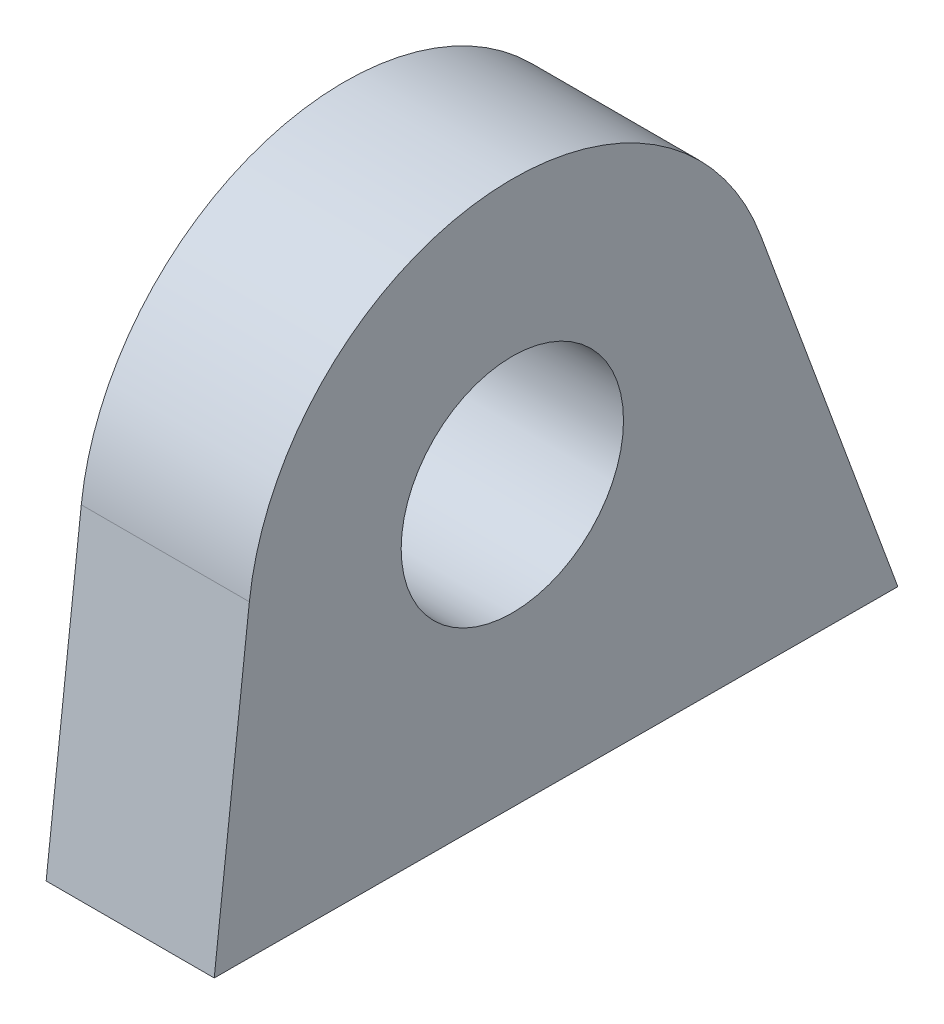
ISO-10303-21;
HEADER;
FILE_DESCRIPTION(('STEP AP214'),'2;1');
FILE_NAME('part.step','',(''),(''),'','','');
FILE_SCHEMA(('AUTOMOTIVE_DESIGN { 1 0 10303 214 1 1 1 1 }'));
ENDSEC;
DATA;
#1=APPLICATION_CONTEXT('core data for automotive mechanical design processes');
#2=APPLICATION_PROTOCOL_DEFINITION('international standard','automotive_design',2000,#1);
#3=PRODUCT_CONTEXT('',#1,'mechanical');
#4=PRODUCT('Part','Part','',(#3));
#5=PRODUCT_RELATED_PRODUCT_CATEGORY('part','',(#4));
#6=PRODUCT_DEFINITION_FORMATION('','',#4);
#7=PRODUCT_DEFINITION_CONTEXT('part definition',#1,'design');
#8=PRODUCT_DEFINITION('design','',#6,#7);
#9=PRODUCT_DEFINITION_SHAPE('','',#8);
#10=(LENGTH_UNIT() NAMED_UNIT(*) SI_UNIT(.MILLI.,.METRE.));
#11=(NAMED_UNIT(*) PLANE_ANGLE_UNIT() SI_UNIT($,.RADIAN.));
#12=(NAMED_UNIT(*) SI_UNIT($,.STERADIAN.) SOLID_ANGLE_UNIT());
#13=UNCERTAINTY_MEASURE_WITH_UNIT(LENGTH_MEASURE(1.E-05),#10,'distance_accuracy_value','');
#14=(GEOMETRIC_REPRESENTATION_CONTEXT(3) GLOBAL_UNCERTAINTY_ASSIGNED_CONTEXT((#13)) GLOBAL_UNIT_ASSIGNED_CONTEXT((#10,
#11,#12)) REPRESENTATION_CONTEXT('',''));
#15=CARTESIAN_POINT('',(0.,0.,0.));
#16=DIRECTION('',(0.,0.,1.));
#17=DIRECTION('',(1.,0.,0.));
#18=AXIS2_PLACEMENT_3D('',#15,#16,#17);
#19=CARTESIAN_POINT('',(77.6424000700383,357.223601629017,-762.3289681282));
#20=DIRECTION('',(1.,0.,0.));
#21=DIRECTION('',(0.,0.,-1.));
#22=AXIS2_PLACEMENT_3D('',#19,#20,#21);
#23=PLANE('',#22);
#24=DIRECTION('',(0.,-0.00427691607470319,-0.99999085395262));
#25=VECTOR('',#24,1.);
#26=CARTESIAN_POINT('',(77.6424000700383,346.710990224422,-751.065744258363));
#27=LINE('',#26,#25);
#28=CARTESIAN_POINT('',(77.6424000700383,346.710990224422,-751.065744258363));
#29=VERTEX_POINT('',#28);
#30=CARTESIAN_POINT('',(77.6424000700383,346.600522458506,-776.894344502893));
#31=VERTEX_POINT('',#30);
#32=EDGE_CURVE('E96',#29,#31,#27,.T.);
#33=ORIENTED_EDGE('',*,*,#32,.T.);
#34=DIRECTION('',(0.,0.938461388630572,0.345384165892964));
#35=VECTOR('',#34,1.);
#36=CARTESIAN_POINT('',(77.6424000700383,346.600522458506,-776.894344502893));
#37=LINE('',#36,#35);
#38=CARTESIAN_POINT('',(77.6424000700383,360.677443287947,-771.713582014506));
#39=VERTEX_POINT('',#38);
#40=EDGE_CURVE('E91',#31,#39,#37,.T.);
#41=ORIENTED_EDGE('',*,*,#40,.T.);
#42=CARTESIAN_POINT('',(77.6424000700383,357.223601629017,-762.3289681282));
#43=DIRECTION('',(1.,0.,0.));
#44=DIRECTION('',(0.,0.,-1.));
#45=AXIS2_PLACEMENT_3D('',#42,#43,#44);
#46=CIRCLE('',#45,10.);
#47=CARTESIAN_POINT('',(77.6424000700383,358.35627875494,-752.393323079769));
#48=VERTEX_POINT('',#47);
#49=EDGE_CURVE('E94',#39,#48,#46,.T.);
#50=ORIENTED_EDGE('',*,*,#49,.T.);
#51=DIRECTION('',(0.,-0.993564504843091,0.113267712592353));
#52=VECTOR('',#51,1.);
#53=CARTESIAN_POINT('',(77.6424000700383,358.35627875494,-752.393323079769));
#54=LINE('',#53,#52);
#55=EDGE_CURVE('E61',#48,#29,#54,.T.);
#56=ORIENTED_EDGE('',*,*,#55,.T.);
#57=EDGE_LOOP('',(#33,#41,#50,#56));
#58=FACE_BOUND('',#57,.T.);
#59=CARTESIAN_POINT('',(77.6424000700383,357.223601629017,-762.3289681282));
#60=DIRECTION('',(1.,0.,0.));
#61=DIRECTION('',(0.,0.,-1.));
#62=AXIS2_PLACEMENT_3D('',#59,#60,#61);
#63=CIRCLE('',#62,4.19999999999998);
#64=CARTESIAN_POINT('',(77.6424000700383,357.223601629017,-766.5289681282));
#65=VERTEX_POINT('',#64);
#66=EDGE_CURVE('E116',#65,#65,#63,.T.);
#67=ORIENTED_EDGE('',*,*,#66,.F.);
#68=EDGE_LOOP('',(#67));
#69=FACE_BOUND('',#68,.T.);
#70=ADVANCED_FACE('F43',(#58,#69),#23,.T.);
#71=CARTESIAN_POINT('',(71.2924000700384,357.223601629017,-762.3289681282));
#72=DIRECTION('',(1.,0.,0.));
#73=DIRECTION('',(0.,0.,-1.));
#74=AXIS2_PLACEMENT_3D('',#71,#72,#73);
#75=PLANE('',#74);
#76=DIRECTION('',(0.,-0.00427691607470319,-0.99999085395262));
#77=VECTOR('',#76,1.);
#78=CARTESIAN_POINT('',(71.2924000700384,346.710990224422,-751.065744258363));
#79=LINE('',#78,#77);
#80=CARTESIAN_POINT('',(71.2924000700384,346.710990224422,-751.065744258363));
#81=VERTEX_POINT('',#80);
#82=CARTESIAN_POINT('',(71.2924000700384,346.600522458506,-776.894344502893));
#83=VERTEX_POINT('',#82);
#84=EDGE_CURVE('E112',#81,#83,#79,.T.);
#85=ORIENTED_EDGE('',*,*,#84,.F.);
#86=DIRECTION('',(0.,-0.993564504843091,0.113267712592353));
#87=VECTOR('',#86,1.);
#88=CARTESIAN_POINT('',(71.2924000700384,358.35627875494,-752.393323079769));
#89=LINE('',#88,#87);
#90=CARTESIAN_POINT('',(71.2924000700384,358.35627875494,-752.393323079769));
#91=VERTEX_POINT('',#90);
#92=EDGE_CURVE('E84',#91,#81,#89,.T.);
#93=ORIENTED_EDGE('',*,*,#92,.F.);
#94=CARTESIAN_POINT('',(71.2924000700384,357.223601629017,-762.3289681282));
#95=DIRECTION('',(1.,0.,0.));
#96=DIRECTION('',(0.,0.,-1.));
#97=AXIS2_PLACEMENT_3D('',#94,#95,#96);
#98=CIRCLE('',#97,10.);
#99=CARTESIAN_POINT('',(71.2924000700384,360.677443287947,-771.713582014506));
#100=VERTEX_POINT('',#99);
#101=EDGE_CURVE('E78',#100,#91,#98,.T.);
#102=ORIENTED_EDGE('',*,*,#101,.F.);
#103=DIRECTION('',(0.,0.938461388630572,0.345384165892964));
#104=VECTOR('',#103,1.);
#105=CARTESIAN_POINT('',(71.2924000700384,346.600522458506,-776.894344502893));
#106=LINE('',#105,#104);
#107=EDGE_CURVE('E101',#83,#100,#106,.T.);
#108=ORIENTED_EDGE('',*,*,#107,.F.);
#109=EDGE_LOOP('',(#85,#93,#102,#108));
#110=FACE_BOUND('',#109,.T.);
#111=CARTESIAN_POINT('',(71.2924000700384,357.223601629017,-762.3289681282));
#112=DIRECTION('',(1.,0.,0.));
#113=DIRECTION('',(0.,0.,-1.));
#114=AXIS2_PLACEMENT_3D('',#111,#112,#113);
#115=CIRCLE('',#114,4.19999999999998);
#116=CARTESIAN_POINT('',(71.2924000700384,357.223601629017,-766.5289681282));
#117=VERTEX_POINT('',#116);
#118=EDGE_CURVE('E134',#117,#117,#115,.T.);
#119=ORIENTED_EDGE('',*,*,#118,.T.);
#120=EDGE_LOOP('',(#119));
#121=FACE_BOUND('',#120,.T.);
#122=ADVANCED_FACE('F129',(#110,#121),#75,.F.);
#123=CARTESIAN_POINT('',(77.6424000700383,346.710990224422,-751.065744258363));
#124=DIRECTION('',(0.,0.99999085395262,-0.00427691607470319));
#125=DIRECTION('',(0.,0.00427691607470319,0.99999085395262));
#126=AXIS2_PLACEMENT_3D('',#123,#124,#125);
#127=PLANE('',#126);
#128=ORIENTED_EDGE('',*,*,#84,.T.);
#129=DIRECTION('',(-1.,0.,0.));
#130=VECTOR('',#129,1.);
#131=CARTESIAN_POINT('',(77.6424000700383,346.600522458506,-776.894344502893));
#132=LINE('',#131,#130);
#133=EDGE_CURVE('E11',#31,#83,#132,.T.);
#134=ORIENTED_EDGE('',*,*,#133,.F.);
#135=ORIENTED_EDGE('',*,*,#32,.F.);
#136=DIRECTION('',(-1.,0.,0.));
#137=VECTOR('',#136,1.);
#138=CARTESIAN_POINT('',(77.6424000700383,346.710990224422,-751.065744258363));
#139=LINE('',#138,#137);
#140=EDGE_CURVE('E108',#29,#81,#139,.T.);
#141=ORIENTED_EDGE('',*,*,#140,.T.);
#142=EDGE_LOOP('',(#128,#134,#135,#141));
#143=FACE_BOUND('',#142,.T.);
#144=ADVANCED_FACE('F45',(#143),#127,.F.);
#145=CARTESIAN_POINT('',(77.6424000700383,346.600522458506,-776.894344502893));
#146=DIRECTION('',(0.,-0.345384165892964,0.938461388630572));
#147=DIRECTION('',(0.,-0.938461388630572,-0.345384165892964));
#148=AXIS2_PLACEMENT_3D('',#145,#146,#147);
#149=PLANE('',#148);
#150=ORIENTED_EDGE('',*,*,#107,.T.);
#151=DIRECTION('',(-1.,0.,0.));
#152=VECTOR('',#151,1.);
#153=CARTESIAN_POINT('',(77.6424000700383,360.677443287947,-771.713582014506));
#154=LINE('',#153,#152);
#155=EDGE_CURVE('E53',#39,#100,#154,.T.);
#156=ORIENTED_EDGE('',*,*,#155,.F.);
#157=ORIENTED_EDGE('',*,*,#40,.F.);
#158=ORIENTED_EDGE('',*,*,#133,.T.);
#159=EDGE_LOOP('',(#150,#156,#157,#158));
#160=FACE_BOUND('',#159,.T.);
#161=ADVANCED_FACE('F100',(#160),#149,.F.);
#162=CARTESIAN_POINT('',(77.6424000700383,357.223601629017,-762.3289681282));
#163=DIRECTION('',(-1.,0.,0.));
#164=DIRECTION('',(0.,0.,1.));
#165=AXIS2_PLACEMENT_3D('',#162,#163,#164);
#166=CYLINDRICAL_SURFACE('',#165,10.);
#167=ORIENTED_EDGE('',*,*,#101,.T.);
#168=DIRECTION('',(-1.,0.,0.));
#169=VECTOR('',#168,1.);
#170=CARTESIAN_POINT('',(77.6424000700383,358.35627875494,-752.393323079769));
#171=LINE('',#170,#169);
#172=EDGE_CURVE('E103',#48,#91,#171,.T.);
#173=ORIENTED_EDGE('',*,*,#172,.F.);
#174=ORIENTED_EDGE('',*,*,#49,.F.);
#175=ORIENTED_EDGE('',*,*,#155,.T.);
#176=EDGE_LOOP('',(#167,#173,#174,#175));
#177=FACE_BOUND('',#176,.T.);
#178=ADVANCED_FACE('F104',(#177),#166,.T.);
#179=CARTESIAN_POINT('',(77.6424000700383,358.35627875494,-752.393323079769));
#180=DIRECTION('',(0.,-0.113267712592353,-0.993564504843091));
#181=DIRECTION('',(0.,0.993564504843091,-0.113267712592353));
#182=AXIS2_PLACEMENT_3D('',#179,#180,#181);
#183=PLANE('',#182);
#184=ORIENTED_EDGE('',*,*,#92,.T.);
#185=ORIENTED_EDGE('',*,*,#140,.F.);
#186=ORIENTED_EDGE('',*,*,#55,.F.);
#187=ORIENTED_EDGE('',*,*,#172,.T.);
#188=EDGE_LOOP('',(#184,#185,#186,#187));
#189=FACE_BOUND('',#188,.T.);
#190=ADVANCED_FACE('F126',(#189),#183,.F.);
#191=CARTESIAN_POINT('',(77.6424000700383,357.223601629017,-762.3289681282));
#192=DIRECTION('',(-1.,0.,0.));
#193=DIRECTION('',(0.,0.,1.));
#194=AXIS2_PLACEMENT_3D('',#191,#192,#193);
#195=CYLINDRICAL_SURFACE('',#194,4.19999999999998);
#196=ORIENTED_EDGE('',*,*,#66,.T.);
#197=EDGE_LOOP('',(#196));
#198=FACE_BOUND('',#197,.T.);
#199=ORIENTED_EDGE('',*,*,#118,.F.);
#200=EDGE_LOOP('',(#199));
#201=FACE_BOUND('',#200,.T.);
#202=ADVANCED_FACE('F142',(#198,#201),#195,.F.);
#203=CLOSED_SHELL('',(#70,#122,#144,#161,#178,#190,#202));
#204=MANIFOLD_SOLID_BREP('B2',#203);
#205=ADVANCED_BREP_SHAPE_REPRESENTATION('',(#18,#204),#14);
#206=SHAPE_DEFINITION_REPRESENTATION(#9,#205);
ENDSEC;
END-ISO-10303-21;
